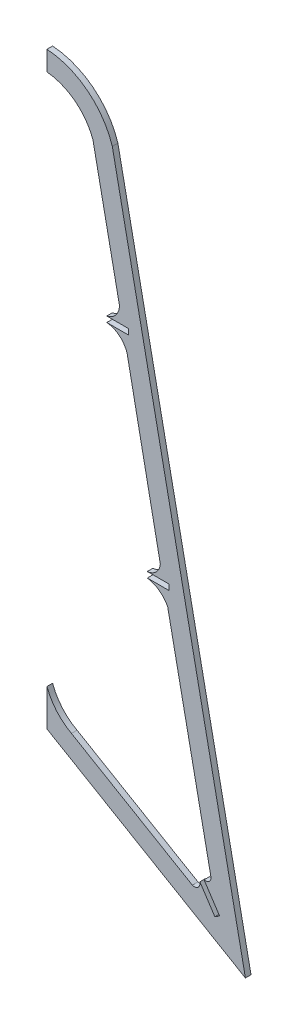
ISO-10303-21;
HEADER;
FILE_DESCRIPTION(('STEP AP214'),'2;1');
FILE_NAME('part.step','',(''),(''),'','','');
FILE_SCHEMA(('AUTOMOTIVE_DESIGN { 1 0 10303 214 1 1 1 1 }'));
ENDSEC;
DATA;
#1=APPLICATION_CONTEXT('core data for automotive mechanical design processes');
#2=APPLICATION_PROTOCOL_DEFINITION('international standard','automotive_design',2000,#1);
#3=PRODUCT_CONTEXT('',#1,'mechanical');
#4=PRODUCT('Part','Part','',(#3));
#5=PRODUCT_RELATED_PRODUCT_CATEGORY('part','',(#4));
#6=PRODUCT_DEFINITION_FORMATION('','',#4);
#7=PRODUCT_DEFINITION_CONTEXT('part definition',#1,'design');
#8=PRODUCT_DEFINITION('design','',#6,#7);
#9=PRODUCT_DEFINITION_SHAPE('','',#8);
#10=(LENGTH_UNIT() NAMED_UNIT(*) SI_UNIT(.MILLI.,.METRE.));
#11=(NAMED_UNIT(*) PLANE_ANGLE_UNIT() SI_UNIT($,.RADIAN.));
#12=(NAMED_UNIT(*) SI_UNIT($,.STERADIAN.) SOLID_ANGLE_UNIT());
#13=UNCERTAINTY_MEASURE_WITH_UNIT(LENGTH_MEASURE(1.E-05),#10,'distance_accuracy_value','');
#14=(GEOMETRIC_REPRESENTATION_CONTEXT(3) GLOBAL_UNCERTAINTY_ASSIGNED_CONTEXT((#13)) GLOBAL_UNIT_ASSIGNED_CONTEXT((#10,
#11,#12)) REPRESENTATION_CONTEXT('',''));
#15=CARTESIAN_POINT('',(0.,0.,0.));
#16=DIRECTION('',(0.,0.,1.));
#17=DIRECTION('',(1.,0.,0.));
#18=AXIS2_PLACEMENT_3D('',#15,#16,#17);
#19=CARTESIAN_POINT('',(-169.581359438299,267.529882646893,2.));
#20=DIRECTION('',(0.,0.,-1.));
#21=DIRECTION('',(-1.,0.,0.));
#22=AXIS2_PLACEMENT_3D('',#19,#20,#21);
#23=CYLINDRICAL_SURFACE('',#22,26.3449884460073);
#24=CARTESIAN_POINT('',(-169.581359438299,267.529882646893,0.));
#25=DIRECTION('',(0.,0.,1.));
#26=DIRECTION('',(1.,0.,0.));
#27=AXIS2_PLACEMENT_3D('',#24,#25,#26);
#28=CIRCLE('',#27,26.3449884460073);
#29=CARTESIAN_POINT('',(-144.463489000568,275.476643049322,0.));
#30=VERTEX_POINT('',#29);
#31=CARTESIAN_POINT('',(-167.743625943436,293.810696025138,0.));
#32=VERTEX_POINT('',#31);
#33=EDGE_CURVE('E237',#30,#32,#28,.T.);
#34=ORIENTED_EDGE('',*,*,#33,.T.);
#35=DIRECTION('',(0.,0.,-1.));
#36=VECTOR('',#35,1.);
#37=CARTESIAN_POINT('',(-167.743625943436,293.810696025138,2.));
#38=LINE('',#37,#36);
#39=CARTESIAN_POINT('',(-167.743625943436,293.810696025138,2.));
#40=VERTEX_POINT('',#39);
#41=EDGE_CURVE('E11',#40,#32,#38,.T.);
#42=ORIENTED_EDGE('',*,*,#41,.F.);
#43=CARTESIAN_POINT('',(-169.581359438299,267.529882646893,2.));
#44=DIRECTION('',(0.,0.,1.));
#45=DIRECTION('',(1.,0.,0.));
#46=AXIS2_PLACEMENT_3D('',#43,#44,#45);
#47=CIRCLE('',#46,26.3449884460073);
#48=CARTESIAN_POINT('',(-144.463489000568,275.476643049322,2.));
#49=VERTEX_POINT('',#48);
#50=EDGE_CURVE('E287',#49,#40,#47,.T.);
#51=ORIENTED_EDGE('',*,*,#50,.F.);
#52=DIRECTION('',(0.,0.,-1.));
#53=VECTOR('',#52,1.);
#54=CARTESIAN_POINT('',(-144.463489000568,275.476643049322,2.));
#55=LINE('',#54,#53);
#56=EDGE_CURVE('E233',#49,#30,#55,.T.);
#57=ORIENTED_EDGE('',*,*,#56,.T.);
#58=EDGE_LOOP('',(#34,#42,#51,#57));
#59=FACE_BOUND('',#58,.T.);
#60=ADVANCED_FACE('F33',(#59),#23,.T.);
#61=CARTESIAN_POINT('',(-167.743625943436,293.810696025138,2.));
#62=DIRECTION('',(0.999999950893562,-0.000313389331779472,0.));
#63=DIRECTION('',(0.000313389331779472,0.999999950893562,0.));
#64=AXIS2_PLACEMENT_3D('',#61,#62,#63);
#65=PLANE('',#64);
#66=DIRECTION('',(-0.000313389331779472,-0.999999950893562,0.));
#67=VECTOR('',#66,1.);
#68=CARTESIAN_POINT('',(-167.743625943436,293.810696025138,0.));
#69=LINE('',#68,#67);
#70=CARTESIAN_POINT('',(-167.74582690555,286.787604353295,0.));
#71=VERTEX_POINT('',#70);
#72=EDGE_CURVE('E240',#32,#71,#69,.T.);
#73=ORIENTED_EDGE('',*,*,#72,.T.);
#74=DIRECTION('',(0.,0.,-1.));
#75=VECTOR('',#74,1.);
#76=CARTESIAN_POINT('',(-167.74582690555,286.787604353295,2.));
#77=LINE('',#76,#75);
#78=CARTESIAN_POINT('',(-167.74582690555,286.787604353295,2.));
#79=VERTEX_POINT('',#78);
#80=EDGE_CURVE('E41',#79,#71,#77,.T.);
#81=ORIENTED_EDGE('',*,*,#80,.F.);
#82=DIRECTION('',(-0.000313389331779472,-0.999999950893562,0.));
#83=VECTOR('',#82,1.);
#84=CARTESIAN_POINT('',(-167.743625943436,293.810696025138,2.));
#85=LINE('',#84,#83);
#86=EDGE_CURVE('E146',#40,#79,#85,.T.);
#87=ORIENTED_EDGE('',*,*,#86,.F.);
#88=ORIENTED_EDGE('',*,*,#41,.T.);
#89=EDGE_LOOP('',(#73,#81,#87,#88));
#90=FACE_BOUND('',#89,.T.);
#91=ADVANCED_FACE('F435',(#90),#65,.F.);
#92=CARTESIAN_POINT('',(-169.581359438299,267.529882646893,2.));
#93=DIRECTION('',(0.,0.,-1.));
#94=DIRECTION('',(-1.,0.,0.));
#95=AXIS2_PLACEMENT_3D('',#92,#93,#94);
#96=CYLINDRICAL_SURFACE('',#95,19.3450000000001);
#97=CARTESIAN_POINT('',(-169.581359438299,267.529882646893,0.));
#98=DIRECTION('',(0.,0.,-1.));
#99=DIRECTION('',(1.,0.,0.));
#100=AXIS2_PLACEMENT_3D('',#97,#98,#99);
#101=CIRCLE('',#100,19.3450000000001);
#102=CARTESIAN_POINT('',(-151.354655658788,274.011880358553,0.));
#103=VERTEX_POINT('',#102);
#104=EDGE_CURVE('E242',#71,#103,#101,.T.);
#105=ORIENTED_EDGE('',*,*,#104,.T.);
#106=DIRECTION('',(0.,0.,-1.));
#107=VECTOR('',#106,1.);
#108=CARTESIAN_POINT('',(-151.354655658788,274.011880358553,2.));
#109=LINE('',#108,#107);
#110=CARTESIAN_POINT('',(-151.354655658788,274.011880358553,2.));
#111=VERTEX_POINT('',#110);
#112=EDGE_CURVE('E348',#111,#103,#109,.T.);
#113=ORIENTED_EDGE('',*,*,#112,.F.);
#114=CARTESIAN_POINT('',(-169.581359438299,267.529882646893,2.));
#115=DIRECTION('',(0.,0.,-1.));
#116=DIRECTION('',(1.,0.,0.));
#117=AXIS2_PLACEMENT_3D('',#114,#115,#116);
#118=CIRCLE('',#117,19.3450000000001);
#119=EDGE_CURVE('E356',#79,#111,#118,.T.);
#120=ORIENTED_EDGE('',*,*,#119,.F.);
#121=ORIENTED_EDGE('',*,*,#80,.T.);
#122=EDGE_LOOP('',(#105,#113,#120,#121));
#123=FACE_BOUND('',#122,.T.);
#124=ADVANCED_FACE('F354',(#123),#96,.F.);
#125=CARTESIAN_POINT('',(-151.354655658788,274.011880358553,2.));
#126=DIRECTION('',(0.979887703080504,0.199549716490936,0.));
#127=DIRECTION('',(-0.199549716490936,0.979887703080505,0.));
#128=AXIS2_PLACEMENT_3D('',#125,#126,#127);
#129=PLANE('',#128);
#130=DIRECTION('',(0.199549716490936,-0.979887703080504,0.));
#131=VECTOR('',#130,1.);
#132=CARTESIAN_POINT('',(-151.354655658788,274.011880358553,0.));
#133=LINE('',#132,#131);
#134=CARTESIAN_POINT('',(-141.897210514378,227.571151889828,0.));
#135=VERTEX_POINT('',#134);
#136=EDGE_CURVE('E244',#103,#135,#133,.T.);
#137=ORIENTED_EDGE('',*,*,#136,.T.);
#138=DIRECTION('',(0.,0.,-1.));
#139=VECTOR('',#138,1.);
#140=CARTESIAN_POINT('',(-141.897210514378,227.571151889828,2.));
#141=LINE('',#140,#139);
#142=CARTESIAN_POINT('',(-141.897210514378,227.571151889828,2.));
#143=VERTEX_POINT('',#142);
#144=EDGE_CURVE('E345',#143,#135,#141,.T.);
#145=ORIENTED_EDGE('',*,*,#144,.F.);
#146=DIRECTION('',(0.199549716490936,-0.979887703080504,0.));
#147=VECTOR('',#146,1.);
#148=CARTESIAN_POINT('',(-151.354655658788,274.011880358553,2.));
#149=LINE('',#148,#147);
#150=EDGE_CURVE('E374',#111,#143,#149,.T.);
#151=ORIENTED_EDGE('',*,*,#150,.F.);
#152=ORIENTED_EDGE('',*,*,#112,.T.);
#153=EDGE_LOOP('',(#137,#145,#151,#152));
#154=FACE_BOUND('',#153,.T.);
#155=ADVANCED_FACE('F365',(#154),#129,.F.);
#156=CARTESIAN_POINT('',(-147.604552213015,227.699552673555,2.));
#157=DIRECTION('',(0.,0.,-1.));
#158=DIRECTION('',(-1.,0.,0.));
#159=AXIS2_PLACEMENT_3D('',#156,#157,#158);
#160=CYLINDRICAL_SURFACE('',#159,5.70878586270888);
#161=CARTESIAN_POINT('',(-147.604552213015,227.699552673555,0.));
#162=DIRECTION('',(0.,0.,-1.));
#163=DIRECTION('',(1.,0.,0.));
#164=AXIS2_PLACEMENT_3D('',#161,#162,#163);
#165=CIRCLE('',#164,5.70878586270888);
#166=CARTESIAN_POINT('',(-146.432560896096,222.112364438017,0.));
#167=VERTEX_POINT('',#166);
#168=EDGE_CURVE('E246',#135,#167,#165,.T.);
#169=ORIENTED_EDGE('',*,*,#168,.T.);
#170=DIRECTION('',(0.,0.,-1.));
#171=VECTOR('',#170,1.);
#172=CARTESIAN_POINT('',(-146.432560896096,222.112364438017,2.));
#173=LINE('',#172,#171);
#174=CARTESIAN_POINT('',(-146.432560896096,222.112364438017,2.));
#175=VERTEX_POINT('',#174);
#176=EDGE_CURVE('E342',#175,#167,#173,.T.);
#177=ORIENTED_EDGE('',*,*,#176,.F.);
#178=CARTESIAN_POINT('',(-147.604552213015,227.699552673555,2.));
#179=DIRECTION('',(0.,0.,-1.));
#180=DIRECTION('',(1.,0.,0.));
#181=AXIS2_PLACEMENT_3D('',#178,#179,#180);
#182=CIRCLE('',#181,5.70878586270888);
#183=EDGE_CURVE('E371',#143,#175,#182,.T.);
#184=ORIENTED_EDGE('',*,*,#183,.F.);
#185=ORIENTED_EDGE('',*,*,#144,.T.);
#186=EDGE_LOOP('',(#169,#177,#184,#185));
#187=FACE_BOUND('',#186,.T.);
#188=ADVANCED_FACE('F369',(#187),#160,.F.);
#189=CARTESIAN_POINT('',(-146.432560896096,222.112364438017,2.));
#190=DIRECTION('',(0.,1.,0.));
#191=DIRECTION('',(0.,0.,1.));
#192=AXIS2_PLACEMENT_3D('',#189,#190,#191);
#193=PLANE('',#192);
#194=DIRECTION('',(1.,0.,0.));
#195=VECTOR('',#194,1.);
#196=CARTESIAN_POINT('',(-146.432560896096,222.112364438017,0.));
#197=LINE('',#196,#195);
#198=CARTESIAN_POINT('',(-138.679952297794,222.112364438017,0.));
#199=VERTEX_POINT('',#198);
#200=EDGE_CURVE('E248',#167,#199,#197,.T.);
#201=ORIENTED_EDGE('',*,*,#200,.T.);
#202=DIRECTION('',(0.,0.,-1.));
#203=VECTOR('',#202,1.);
#204=CARTESIAN_POINT('',(-138.679952297794,222.112364438017,2.));
#205=LINE('',#204,#203);
#206=CARTESIAN_POINT('',(-138.679952297794,222.112364438017,2.));
#207=VERTEX_POINT('',#206);
#208=EDGE_CURVE('E339',#207,#199,#205,.T.);
#209=ORIENTED_EDGE('',*,*,#208,.F.);
#210=DIRECTION('',(1.,0.,0.));
#211=VECTOR('',#210,1.);
#212=CARTESIAN_POINT('',(-146.432560896096,222.112364438017,2.));
#213=LINE('',#212,#211);
#214=EDGE_CURVE('E373',#175,#207,#213,.T.);
#215=ORIENTED_EDGE('',*,*,#214,.F.);
#216=ORIENTED_EDGE('',*,*,#176,.T.);
#217=EDGE_LOOP('',(#201,#209,#215,#216));
#218=FACE_BOUND('',#217,.T.);
#219=ADVANCED_FACE('F448',(#218),#193,.F.);
#220=CARTESIAN_POINT('',(-138.679952297794,222.112364438017,2.));
#221=DIRECTION('',(1.,0.,0.));
#222=DIRECTION('',(0.,0.,-1.));
#223=AXIS2_PLACEMENT_3D('',#220,#221,#222);
#224=PLANE('',#223);
#225=DIRECTION('',(0.,-1.,0.));
#226=VECTOR('',#225,1.);
#227=CARTESIAN_POINT('',(-138.679952297794,222.112364438017,0.));
#228=LINE('',#227,#226);
#229=CARTESIAN_POINT('',(-138.679952297794,220.112364438017,0.));
#230=VERTEX_POINT('',#229);
#231=EDGE_CURVE('E250',#199,#230,#228,.T.);
#232=ORIENTED_EDGE('',*,*,#231,.T.);
#233=DIRECTION('',(0.,0.,-1.));
#234=VECTOR('',#233,1.);
#235=CARTESIAN_POINT('',(-138.679952297794,220.112364438017,2.));
#236=LINE('',#235,#234);
#237=CARTESIAN_POINT('',(-138.679952297794,220.112364438017,2.));
#238=VERTEX_POINT('',#237);
#239=EDGE_CURVE('E336',#238,#230,#236,.T.);
#240=ORIENTED_EDGE('',*,*,#239,.F.);
#241=DIRECTION('',(0.,-1.,0.));
#242=VECTOR('',#241,1.);
#243=CARTESIAN_POINT('',(-138.679952297794,222.112364438017,2.));
#244=LINE('',#243,#242);
#245=EDGE_CURVE('E376',#207,#238,#244,.T.);
#246=ORIENTED_EDGE('',*,*,#245,.F.);
#247=ORIENTED_EDGE('',*,*,#208,.T.);
#248=EDGE_LOOP('',(#232,#240,#246,#247));
#249=FACE_BOUND('',#248,.T.);
#250=ADVANCED_FACE('F451',(#249),#224,.F.);
#251=CARTESIAN_POINT('',(-138.679952297794,220.112364438017,2.));
#252=DIRECTION('',(-1.43206381509877E-13,-1.,0.));
#253=DIRECTION('',(1.,-1.43206381509877E-13,0.));
#254=AXIS2_PLACEMENT_3D('',#251,#252,#253);
#255=PLANE('',#254);
#256=DIRECTION('',(-1.,1.43206381509877E-13,0.));
#257=VECTOR('',#256,1.);
#258=CARTESIAN_POINT('',(-138.679952297794,220.112364438017,0.));
#259=LINE('',#258,#257);
#260=CARTESIAN_POINT('',(-146.432560896096,220.112364438018,0.));
#261=VERTEX_POINT('',#260);
#262=EDGE_CURVE('E252',#230,#261,#259,.T.);
#263=ORIENTED_EDGE('',*,*,#262,.T.);
#264=DIRECTION('',(0.,0.,-1.));
#265=VECTOR('',#264,1.);
#266=CARTESIAN_POINT('',(-146.432560896096,220.112364438018,2.));
#267=LINE('',#266,#265);
#268=CARTESIAN_POINT('',(-146.432560896096,220.112364438018,2.));
#269=VERTEX_POINT('',#268);
#270=EDGE_CURVE('E333',#269,#261,#267,.T.);
#271=ORIENTED_EDGE('',*,*,#270,.F.);
#272=DIRECTION('',(-1.,1.43206381509877E-13,0.));
#273=VECTOR('',#272,1.);
#274=CARTESIAN_POINT('',(-138.679952297794,220.112364438017,2.));
#275=LINE('',#274,#273);
#276=EDGE_CURVE('E382',#238,#269,#275,.T.);
#277=ORIENTED_EDGE('',*,*,#276,.F.);
#278=ORIENTED_EDGE('',*,*,#239,.T.);
#279=EDGE_LOOP('',(#263,#271,#277,#278));
#280=FACE_BOUND('',#279,.T.);
#281=ADVANCED_FACE('F455',(#280),#255,.F.);
#282=CARTESIAN_POINT('',(-147.208362580016,211.751156181154,2.));
#283=DIRECTION('',(0.,0.,-1.));
#284=DIRECTION('',(-1.,0.,0.));
#285=AXIS2_PLACEMENT_3D('',#282,#283,#284);
#286=CYLINDRICAL_SURFACE('',#285,8.39712282674394);
#287=CARTESIAN_POINT('',(-147.208362580016,211.751156181154,0.));
#288=DIRECTION('',(0.,0.,-1.));
#289=DIRECTION('',(1.,0.,0.));
#290=AXIS2_PLACEMENT_3D('',#287,#288,#289);
#291=CIRCLE('',#290,8.39712282674394);
#292=CARTESIAN_POINT('',(-139.1701284323,214.179831448438,0.));
#293=VERTEX_POINT('',#292);
#294=EDGE_CURVE('E254',#261,#293,#291,.T.);
#295=ORIENTED_EDGE('',*,*,#294,.T.);
#296=DIRECTION('',(0.,0.,-1.));
#297=VECTOR('',#296,1.);
#298=CARTESIAN_POINT('',(-139.1701284323,214.179831448438,2.));
#299=LINE('',#298,#297);
#300=CARTESIAN_POINT('',(-139.1701284323,214.179831448438,2.));
#301=VERTEX_POINT('',#300);
#302=EDGE_CURVE('E330',#301,#293,#299,.T.);
#303=ORIENTED_EDGE('',*,*,#302,.F.);
#304=CARTESIAN_POINT('',(-147.208362580016,211.751156181154,2.));
#305=DIRECTION('',(0.,0.,-1.));
#306=DIRECTION('',(1.,0.,0.));
#307=AXIS2_PLACEMENT_3D('',#304,#305,#306);
#308=CIRCLE('',#307,8.39712282674394);
#309=EDGE_CURVE('E384',#269,#301,#308,.T.);
#310=ORIENTED_EDGE('',*,*,#309,.F.);
#311=ORIENTED_EDGE('',*,*,#270,.T.);
#312=EDGE_LOOP('',(#295,#303,#310,#311));
#313=FACE_BOUND('',#312,.T.);
#314=ADVANCED_FACE('F459',(#313),#286,.F.);
#315=CARTESIAN_POINT('',(-139.1701284323,214.179831448438,2.));
#316=DIRECTION('',(0.980552630104531,0.196256310968813,0.));
#317=DIRECTION('',(-0.196256310968813,0.980552630104531,0.));
#318=AXIS2_PLACEMENT_3D('',#315,#316,#317);
#319=PLANE('',#318);
#320=DIRECTION('',(0.196256310968813,-0.980552630104531,0.));
#321=VECTOR('',#320,1.);
#322=CARTESIAN_POINT('',(-139.1701284323,214.179831448438,0.));
#323=LINE('',#322,#321);
#324=CARTESIAN_POINT('',(-127.347591585276,155.111057850124,0.));
#325=VERTEX_POINT('',#324);
#326=EDGE_CURVE('E256',#293,#325,#323,.T.);
#327=ORIENTED_EDGE('',*,*,#326,.T.);
#328=DIRECTION('',(0.,0.,-1.));
#329=VECTOR('',#328,1.);
#330=CARTESIAN_POINT('',(-127.347591585276,155.111057850124,2.));
#331=LINE('',#330,#329);
#332=CARTESIAN_POINT('',(-127.347591585276,155.111057850124,2.));
#333=VERTEX_POINT('',#332);
#334=EDGE_CURVE('E327',#333,#325,#331,.T.);
#335=ORIENTED_EDGE('',*,*,#334,.F.);
#336=DIRECTION('',(0.196256310968813,-0.980552630104531,0.));
#337=VECTOR('',#336,1.);
#338=CARTESIAN_POINT('',(-139.1701284323,214.179831448438,2.));
#339=LINE('',#338,#337);
#340=EDGE_CURVE('E386',#301,#333,#339,.T.);
#341=ORIENTED_EDGE('',*,*,#340,.F.);
#342=ORIENTED_EDGE('',*,*,#302,.T.);
#343=EDGE_LOOP('',(#327,#335,#341,#342));
#344=FACE_BOUND('',#343,.T.);
#345=ADVANCED_FACE('F463',(#344),#319,.F.);
#346=CARTESIAN_POINT('',(-132.404934353409,155.523813116344,2.));
#347=DIRECTION('',(0.,0.,-1.));
#348=DIRECTION('',(-1.,0.,0.));
#349=AXIS2_PLACEMENT_3D('',#346,#347,#348);
#350=CYLINDRICAL_SURFACE('',#349,5.07415833258849);
#351=CARTESIAN_POINT('',(-132.404934353409,155.523813116344,0.));
#352=DIRECTION('',(0.,0.,-1.));
#353=DIRECTION('',(1.,0.,0.));
#354=AXIS2_PLACEMENT_3D('',#351,#352,#353);
#355=CIRCLE('',#354,5.07415833258849);
#356=CARTESIAN_POINT('',(-131.991729698829,150.466507045162,0.));
#357=VERTEX_POINT('',#356);
#358=EDGE_CURVE('E258',#325,#357,#355,.T.);
#359=ORIENTED_EDGE('',*,*,#358,.T.);
#360=DIRECTION('',(0.,0.,-1.));
#361=VECTOR('',#360,1.);
#362=CARTESIAN_POINT('',(-131.991729698829,150.466507045162,2.));
#363=LINE('',#362,#361);
#364=CARTESIAN_POINT('',(-131.991729698829,150.466507045162,2.));
#365=VERTEX_POINT('',#364);
#366=EDGE_CURVE('E324',#365,#357,#363,.T.);
#367=ORIENTED_EDGE('',*,*,#366,.F.);
#368=CARTESIAN_POINT('',(-132.404934353409,155.523813116344,2.));
#369=DIRECTION('',(0.,0.,-1.));
#370=DIRECTION('',(1.,0.,0.));
#371=AXIS2_PLACEMENT_3D('',#368,#369,#370);
#372=CIRCLE('',#371,5.07415833258849);
#373=EDGE_CURVE('E388',#333,#365,#372,.T.);
#374=ORIENTED_EDGE('',*,*,#373,.F.);
#375=ORIENTED_EDGE('',*,*,#334,.T.);
#376=EDGE_LOOP('',(#359,#367,#374,#375));
#377=FACE_BOUND('',#376,.T.);
#378=ADVANCED_FACE('F467',(#377),#350,.F.);
#379=CARTESIAN_POINT('',(-124.202532500798,150.46556118674,2.));
#380=DIRECTION('',(0.000121432079720749,0.999999992627125,0.));
#381=DIRECTION('',(-0.999999992627125,0.000121432079720749,0.));
#382=AXIS2_PLACEMENT_3D('',#379,#380,#381);
#383=PLANE('',#382);
#384=DIRECTION('',(0.999999992627125,-0.000121432079720749,0.));
#385=VECTOR('',#384,1.);
#386=CARTESIAN_POINT('',(-124.202532500798,150.46556118674,0.));
#387=LINE('',#386,#385);
#388=CARTESIAN_POINT('',(-124.202532500798,150.46556118674,0.));
#389=VERTEX_POINT('',#388);
#390=EDGE_CURVE('E260',#357,#389,#387,.T.);
#391=ORIENTED_EDGE('',*,*,#390,.T.);
#392=DIRECTION('',(0.,0.,-1.));
#393=VECTOR('',#392,1.);
#394=CARTESIAN_POINT('',(-124.202532500798,150.46556118674,2.));
#395=LINE('',#394,#393);
#396=CARTESIAN_POINT('',(-124.202532500798,150.46556118674,2.));
#397=VERTEX_POINT('',#396);
#398=EDGE_CURVE('E321',#397,#389,#395,.T.);
#399=ORIENTED_EDGE('',*,*,#398,.F.);
#400=DIRECTION('',(0.999999992627125,-0.000121432079720749,0.));
#401=VECTOR('',#400,1.);
#402=CARTESIAN_POINT('',(-124.202532500798,150.46556118674,2.));
#403=LINE('',#402,#401);
#404=EDGE_CURVE('E390',#365,#397,#403,.T.);
#405=ORIENTED_EDGE('',*,*,#404,.F.);
#406=ORIENTED_EDGE('',*,*,#366,.T.);
#407=EDGE_LOOP('',(#391,#399,#405,#406));
#408=FACE_BOUND('',#407,.T.);
#409=ADVANCED_FACE('F471',(#408),#383,.F.);
#410=CARTESIAN_POINT('',(-124.202532500798,148.46556118674,2.));
#411=DIRECTION('',(1.,0.,0.));
#412=DIRECTION('',(0.,0.,-1.));
#413=AXIS2_PLACEMENT_3D('',#410,#411,#412);
#414=PLANE('',#413);
#415=DIRECTION('',(0.,-1.,0.));
#416=VECTOR('',#415,1.);
#417=CARTESIAN_POINT('',(-124.202532500798,148.46556118674,0.));
#418=LINE('',#417,#416);
#419=CARTESIAN_POINT('',(-124.202532500798,148.46556118674,0.));
#420=VERTEX_POINT('',#419);
#421=EDGE_CURVE('E262',#389,#420,#418,.T.);
#422=ORIENTED_EDGE('',*,*,#421,.T.);
#423=DIRECTION('',(0.,0.,-1.));
#424=VECTOR('',#423,1.);
#425=CARTESIAN_POINT('',(-124.202532500798,148.46556118674,2.));
#426=LINE('',#425,#424);
#427=CARTESIAN_POINT('',(-124.202532500798,148.46556118674,2.));
#428=VERTEX_POINT('',#427);
#429=EDGE_CURVE('E318',#428,#420,#426,.T.);
#430=ORIENTED_EDGE('',*,*,#429,.F.);
#431=DIRECTION('',(0.,-1.,0.));
#432=VECTOR('',#431,1.);
#433=CARTESIAN_POINT('',(-124.202532500798,148.46556118674,2.));
#434=LINE('',#433,#432);
#435=EDGE_CURVE('E392',#397,#428,#434,.T.);
#436=ORIENTED_EDGE('',*,*,#435,.F.);
#437=ORIENTED_EDGE('',*,*,#398,.T.);
#438=EDGE_LOOP('',(#422,#430,#436,#437));
#439=FACE_BOUND('',#438,.T.);
#440=ADVANCED_FACE('F475',(#439),#414,.F.);
#441=CARTESIAN_POINT('',(-131.975142876382,148.46556118674,2.));
#442=DIRECTION('',(0.,-1.,0.));
#443=DIRECTION('',(0.,0.,-1.));
#444=AXIS2_PLACEMENT_3D('',#441,#442,#443);
#445=PLANE('',#444);
#446=DIRECTION('',(-1.,0.,0.));
#447=VECTOR('',#446,1.);
#448=CARTESIAN_POINT('',(-131.975142876382,148.46556118674,0.));
#449=LINE('',#448,#447);
#450=CARTESIAN_POINT('',(-131.975142876382,148.46556118674,0.));
#451=VERTEX_POINT('',#450);
#452=EDGE_CURVE('E264',#420,#451,#449,.T.);
#453=ORIENTED_EDGE('',*,*,#452,.T.);
#454=DIRECTION('',(0.,0.,-1.));
#455=VECTOR('',#454,1.);
#456=CARTESIAN_POINT('',(-131.975142876382,148.46556118674,2.));
#457=LINE('',#456,#455);
#458=CARTESIAN_POINT('',(-131.975142876382,148.46556118674,2.));
#459=VERTEX_POINT('',#458);
#460=EDGE_CURVE('E315',#459,#451,#457,.T.);
#461=ORIENTED_EDGE('',*,*,#460,.F.);
#462=DIRECTION('',(-1.,0.,0.));
#463=VECTOR('',#462,1.);
#464=CARTESIAN_POINT('',(-131.975142876382,148.46556118674,2.));
#465=LINE('',#464,#463);
#466=EDGE_CURVE('E394',#428,#459,#465,.T.);
#467=ORIENTED_EDGE('',*,*,#466,.F.);
#468=ORIENTED_EDGE('',*,*,#429,.T.);
#469=EDGE_LOOP('',(#453,#461,#467,#468));
#470=FACE_BOUND('',#469,.T.);
#471=ADVANCED_FACE('F479',(#470),#445,.F.);
#472=CARTESIAN_POINT('',(-133.445473819778,138.794497559774,2.));
#473=DIRECTION('',(0.,0.,-1.));
#474=DIRECTION('',(-1.,0.,0.));
#475=AXIS2_PLACEMENT_3D('',#472,#473,#474);
#476=CYLINDRICAL_SURFACE('',#475,9.78219529348757);
#477=CARTESIAN_POINT('',(-133.445473819778,138.794497559774,0.));
#478=DIRECTION('',(0.,0.,-1.));
#479=DIRECTION('',(1.,0.,0.));
#480=AXIS2_PLACEMENT_3D('',#477,#478,#479);
#481=CIRCLE('',#480,9.78219529348757);
#482=CARTESIAN_POINT('',(-124.718064663381,143.213057752504,0.));
#483=VERTEX_POINT('',#482);
#484=EDGE_CURVE('E266',#451,#483,#481,.T.);
#485=ORIENTED_EDGE('',*,*,#484,.T.);
#486=DIRECTION('',(0.,0.,-1.));
#487=VECTOR('',#486,1.);
#488=CARTESIAN_POINT('',(-124.718064663381,143.213057752504,2.));
#489=LINE('',#488,#487);
#490=CARTESIAN_POINT('',(-124.718064663381,143.213057752504,2.));
#491=VERTEX_POINT('',#490);
#492=EDGE_CURVE('E312',#491,#483,#489,.T.);
#493=ORIENTED_EDGE('',*,*,#492,.F.);
#494=CARTESIAN_POINT('',(-133.445473819778,138.794497559774,2.));
#495=DIRECTION('',(0.,0.,-1.));
#496=DIRECTION('',(1.,0.,0.));
#497=AXIS2_PLACEMENT_3D('',#494,#495,#496);
#498=CIRCLE('',#497,9.78219529348757);
#499=EDGE_CURVE('E396',#459,#491,#498,.T.);
#500=ORIENTED_EDGE('',*,*,#499,.F.);
#501=ORIENTED_EDGE('',*,*,#460,.T.);
#502=EDGE_LOOP('',(#485,#493,#500,#501));
#503=FACE_BOUND('',#502,.T.);
#504=ADVANCED_FACE('F483',(#503),#476,.F.);
#505=CARTESIAN_POINT('',(-124.718064663381,143.213057752504,2.));
#506=DIRECTION('',(0.979887703080503,0.199549716490943,0.));
#507=DIRECTION('',(-0.199549716490943,0.979887703080503,0.));
#508=AXIS2_PLACEMENT_3D('',#505,#506,#507);
#509=PLANE('',#508);
#510=DIRECTION('',(0.199549716490943,-0.979887703080503,0.));
#511=VECTOR('',#510,1.);
#512=CARTESIAN_POINT('',(-124.718064663381,143.213057752504,0.));
#513=LINE('',#512,#511);
#514=CARTESIAN_POINT('',(-109.314139037206,67.5721720339745,0.));
#515=VERTEX_POINT('',#514);
#516=EDGE_CURVE('E268',#483,#515,#513,.T.);
#517=ORIENTED_EDGE('',*,*,#516,.T.);
#518=DIRECTION('',(0.,0.,-1.));
#519=VECTOR('',#518,1.);
#520=CARTESIAN_POINT('',(-109.314139037206,67.5721720339745,2.));
#521=LINE('',#520,#519);
#522=CARTESIAN_POINT('',(-109.314139037206,67.5721720339745,2.));
#523=VERTEX_POINT('',#522);
#524=EDGE_CURVE('E309',#523,#515,#521,.T.);
#525=ORIENTED_EDGE('',*,*,#524,.F.);
#526=DIRECTION('',(0.199549716490943,-0.979887703080503,0.));
#527=VECTOR('',#526,1.);
#528=CARTESIAN_POINT('',(-124.718064663381,143.213057752504,2.));
#529=LINE('',#528,#527);
#530=EDGE_CURVE('E398',#491,#523,#529,.T.);
#531=ORIENTED_EDGE('',*,*,#530,.F.);
#532=ORIENTED_EDGE('',*,*,#492,.T.);
#533=EDGE_LOOP('',(#517,#525,#531,#532));
#534=FACE_BOUND('',#533,.T.);
#535=ADVANCED_FACE('F487',(#534),#509,.F.);
#536=CARTESIAN_POINT('',(-111.249549060774,67.2897595549481,2.));
#537=DIRECTION('',(0.,0.,-1.));
#538=DIRECTION('',(-1.,0.,0.));
#539=AXIS2_PLACEMENT_3D('',#536,#537,#538);
#540=CYLINDRICAL_SURFACE('',#539,1.95590612444396);
#541=CARTESIAN_POINT('',(-111.249549060774,67.2897595549481,0.));
#542=DIRECTION('',(0.,0.,-1.));
#543=DIRECTION('',(1.,0.,0.));
#544=AXIS2_PLACEMENT_3D('',#541,#542,#543);
#545=CIRCLE('',#544,1.95590612444396);
#546=CARTESIAN_POINT('',(-111.744040833778,65.3973941953865,0.));
#547=VERTEX_POINT('',#546);
#548=EDGE_CURVE('E270',#515,#547,#545,.T.);
#549=ORIENTED_EDGE('',*,*,#548,.T.);
#550=DIRECTION('',(0.,0.,-1.));
#551=VECTOR('',#550,1.);
#552=CARTESIAN_POINT('',(-111.744040833778,65.3973941953865,2.));
#553=LINE('',#552,#551);
#554=CARTESIAN_POINT('',(-111.744040833778,65.3973941953865,2.));
#555=VERTEX_POINT('',#554);
#556=EDGE_CURVE('E306',#555,#547,#553,.T.);
#557=ORIENTED_EDGE('',*,*,#556,.F.);
#558=CARTESIAN_POINT('',(-111.249549060774,67.2897595549481,2.));
#559=DIRECTION('',(0.,0.,-1.));
#560=DIRECTION('',(1.,0.,0.));
#561=AXIS2_PLACEMENT_3D('',#558,#559,#560);
#562=CIRCLE('',#561,1.95590612444396);
#563=EDGE_CURVE('E400',#523,#555,#562,.T.);
#564=ORIENTED_EDGE('',*,*,#563,.F.);
#565=ORIENTED_EDGE('',*,*,#524,.T.);
#566=EDGE_LOOP('',(#549,#557,#564,#565));
#567=FACE_BOUND('',#566,.T.);
#568=ADVANCED_FACE('F491',(#567),#540,.F.);
#569=CARTESIAN_POINT('',(-106.221436179066,57.0262391521466,2.));
#570=DIRECTION('',(0.834717471240344,0.550678439024197,0.));
#571=DIRECTION('',(-0.550678439024197,0.834717471240344,0.));
#572=AXIS2_PLACEMENT_3D('',#569,#570,#571);
#573=PLANE('',#572);
#574=DIRECTION('',(0.550678439024197,-0.834717471240344,0.));
#575=VECTOR('',#574,1.);
#576=CARTESIAN_POINT('',(-106.221436179066,57.0262391521466,0.));
#577=LINE('',#576,#575);
#578=CARTESIAN_POINT('',(-106.221436179066,57.0262391521466,0.));
#579=VERTEX_POINT('',#578);
#580=EDGE_CURVE('E272',#547,#579,#577,.T.);
#581=ORIENTED_EDGE('',*,*,#580,.T.);
#582=DIRECTION('',(0.,0.,-1.));
#583=VECTOR('',#582,1.);
#584=CARTESIAN_POINT('',(-106.221436179066,57.0262391521466,2.));
#585=LINE('',#584,#583);
#586=CARTESIAN_POINT('',(-106.221436179066,57.0262391521466,2.));
#587=VERTEX_POINT('',#586);
#588=EDGE_CURVE('E303',#587,#579,#585,.T.);
#589=ORIENTED_EDGE('',*,*,#588,.F.);
#590=DIRECTION('',(0.550678439024197,-0.834717471240344,0.));
#591=VECTOR('',#590,1.);
#592=CARTESIAN_POINT('',(-106.221436179066,57.0262391521466,2.));
#593=LINE('',#592,#591);
#594=EDGE_CURVE('E402',#555,#587,#593,.T.);
#595=ORIENTED_EDGE('',*,*,#594,.F.);
#596=ORIENTED_EDGE('',*,*,#556,.T.);
#597=EDGE_LOOP('',(#581,#589,#595,#596));
#598=FACE_BOUND('',#597,.T.);
#599=ADVANCED_FACE('F495',(#598),#573,.F.);
#600=CARTESIAN_POINT('',(-107.888289043611,55.920988196606,2.));
#601=DIRECTION('',(0.552626987358298,-0.833428708914741,0.));
#602=DIRECTION('',(0.833428708914741,0.552626987358298,0.));
#603=AXIS2_PLACEMENT_3D('',#600,#601,#602);
#604=PLANE('',#603);
#605=DIRECTION('',(-0.833428708914741,-0.552626987358298,0.));
#606=VECTOR('',#605,1.);
#607=CARTESIAN_POINT('',(-107.888289043611,55.920988196606,0.));
#608=LINE('',#607,#606);
#609=CARTESIAN_POINT('',(-107.888289043611,55.920988196606,0.));
#610=VERTEX_POINT('',#609);
#611=EDGE_CURVE('E274',#579,#610,#608,.T.);
#612=ORIENTED_EDGE('',*,*,#611,.T.);
#613=DIRECTION('',(0.,0.,-1.));
#614=VECTOR('',#613,1.);
#615=CARTESIAN_POINT('',(-107.888289043611,55.920988196606,2.));
#616=LINE('',#615,#614);
#617=CARTESIAN_POINT('',(-107.888289043611,55.920988196606,2.));
#618=VERTEX_POINT('',#617);
#619=EDGE_CURVE('E300',#618,#610,#616,.T.);
#620=ORIENTED_EDGE('',*,*,#619,.F.);
#621=DIRECTION('',(-0.833428708914741,-0.552626987358298,0.));
#622=VECTOR('',#621,1.);
#623=CARTESIAN_POINT('',(-107.888289043611,55.920988196606,2.));
#624=LINE('',#623,#622);
#625=EDGE_CURVE('E404',#587,#618,#624,.T.);
#626=ORIENTED_EDGE('',*,*,#625,.F.);
#627=ORIENTED_EDGE('',*,*,#588,.T.);
#628=EDGE_LOOP('',(#612,#620,#626,#627));
#629=FACE_BOUND('',#628,.T.);
#630=ADVANCED_FACE('F499',(#629),#604,.F.);
#631=CARTESIAN_POINT('',(-113.250526418095,64.0490798447626,2.));
#632=DIRECTION('',(-0.834718127224239,-0.5506774446836,0.));
#633=DIRECTION('',(0.5506774446836,-0.834718127224239,0.));
#634=AXIS2_PLACEMENT_3D('',#631,#632,#633);
#635=PLANE('',#634);
#636=DIRECTION('',(-0.5506774446836,0.834718127224239,0.));
#637=VECTOR('',#636,1.);
#638=CARTESIAN_POINT('',(-113.250526418095,64.0490798447626,0.));
#639=LINE('',#638,#637);
#640=CARTESIAN_POINT('',(-113.250526418095,64.0490798447626,0.));
#641=VERTEX_POINT('',#640);
#642=EDGE_CURVE('E276',#610,#641,#639,.T.);
#643=ORIENTED_EDGE('',*,*,#642,.T.);
#644=DIRECTION('',(0.,0.,-1.));
#645=VECTOR('',#644,1.);
#646=CARTESIAN_POINT('',(-113.250526418095,64.0490798447626,2.));
#647=LINE('',#646,#645);
#648=CARTESIAN_POINT('',(-113.250526418095,64.0490798447626,2.));
#649=VERTEX_POINT('',#648);
#650=EDGE_CURVE('E297',#649,#641,#647,.T.);
#651=ORIENTED_EDGE('',*,*,#650,.F.);
#652=DIRECTION('',(-0.5506774446836,0.834718127224239,0.));
#653=VECTOR('',#652,1.);
#654=CARTESIAN_POINT('',(-113.250526418095,64.0490798447626,2.));
#655=LINE('',#654,#653);
#656=EDGE_CURVE('E406',#618,#649,#655,.T.);
#657=ORIENTED_EDGE('',*,*,#656,.F.);
#658=ORIENTED_EDGE('',*,*,#619,.T.);
#659=EDGE_LOOP('',(#643,#651,#657,#658));
#660=FACE_BOUND('',#659,.T.);
#661=ADVANCED_FACE('F503',(#660),#635,.F.);
#662=CARTESIAN_POINT('',(-115.222388538361,63.575392197159,2.));
#663=DIRECTION('',(0.,0.,-1.));
#664=DIRECTION('',(-1.,0.,0.));
#665=AXIS2_PLACEMENT_3D('',#662,#663,#664);
#666=CYLINDRICAL_SURFACE('',#665,2.02795961715969);
#667=CARTESIAN_POINT('',(-115.222388538361,63.575392197159,0.));
#668=DIRECTION('',(0.,0.,-1.));
#669=DIRECTION('',(1.,0.,0.));
#670=AXIS2_PLACEMENT_3D('',#667,#668,#669);
#671=CIRCLE('',#670,2.02795961715969);
#672=CARTESIAN_POINT('',(-115.91101166002,61.6679283298349,0.));
#673=VERTEX_POINT('',#672);
#674=EDGE_CURVE('E278',#641,#673,#671,.T.);
#675=ORIENTED_EDGE('',*,*,#674,.T.);
#676=DIRECTION('',(0.,0.,-1.));
#677=VECTOR('',#676,1.);
#678=CARTESIAN_POINT('',(-115.91101166002,61.6679283298349,2.));
#679=LINE('',#678,#677);
#680=CARTESIAN_POINT('',(-115.91101166002,61.6679283298349,2.));
#681=VERTEX_POINT('',#680);
#682=EDGE_CURVE('E294',#681,#673,#679,.T.);
#683=ORIENTED_EDGE('',*,*,#682,.F.);
#684=CARTESIAN_POINT('',(-115.222388538361,63.575392197159,2.));
#685=DIRECTION('',(0.,0.,-1.));
#686=DIRECTION('',(1.,0.,0.));
#687=AXIS2_PLACEMENT_3D('',#684,#685,#686);
#688=CIRCLE('',#687,2.02795961715969);
#689=EDGE_CURVE('E408',#649,#681,#688,.T.);
#690=ORIENTED_EDGE('',*,*,#689,.F.);
#691=ORIENTED_EDGE('',*,*,#650,.T.);
#692=EDGE_LOOP('',(#675,#683,#690,#691));
#693=FACE_BOUND('',#692,.T.);
#694=ADVANCED_FACE('F507',(#693),#666,.F.);
#695=CARTESIAN_POINT('',(-159.023635769012,86.9601686673011,2.));
#696=DIRECTION('',(-0.50600718228676,-0.862529264126275,0.));
#697=DIRECTION('',(0.862529264126275,-0.50600718228676,0.));
#698=AXIS2_PLACEMENT_3D('',#695,#696,#697);
#699=PLANE('',#698);
#700=DIRECTION('',(-0.862529264126275,0.50600718228676,0.));
#701=VECTOR('',#700,1.);
#702=CARTESIAN_POINT('',(-159.023635769012,86.9601686673011,0.));
#703=LINE('',#702,#701);
#704=CARTESIAN_POINT('',(-159.023635769012,86.9601686673011,0.));
#705=VERTEX_POINT('',#704);
#706=EDGE_CURVE('E280',#673,#705,#703,.T.);
#707=ORIENTED_EDGE('',*,*,#706,.T.);
#708=DIRECTION('',(0.,0.,-1.));
#709=VECTOR('',#708,1.);
#710=CARTESIAN_POINT('',(-159.023635769012,86.9601686673011,2.));
#711=LINE('',#710,#709);
#712=CARTESIAN_POINT('',(-159.023635769012,86.9601686673011,2.));
#713=VERTEX_POINT('',#712);
#714=EDGE_CURVE('E291',#713,#705,#711,.T.);
#715=ORIENTED_EDGE('',*,*,#714,.F.);
#716=DIRECTION('',(-0.862529264126275,0.50600718228676,0.));
#717=VECTOR('',#716,1.);
#718=CARTESIAN_POINT('',(-159.023635769012,86.9601686673011,2.));
#719=LINE('',#718,#717);
#720=EDGE_CURVE('E410',#681,#713,#719,.T.);
#721=ORIENTED_EDGE('',*,*,#720,.F.);
#722=ORIENTED_EDGE('',*,*,#682,.T.);
#723=EDGE_LOOP('',(#707,#715,#721,#722));
#724=FACE_BOUND('',#723,.T.);
#725=ADVANCED_FACE('F416',(#724),#699,.F.);
#726=CARTESIAN_POINT('',(-150.11682295489,103.434791168473,2.));
#727=DIRECTION('',(0.,0.,-1.));
#728=DIRECTION('',(-1.,0.,0.));
#729=AXIS2_PLACEMENT_3D('',#726,#727,#728);
#730=CYLINDRICAL_SURFACE('',#729,18.7281739916609);
#731=CARTESIAN_POINT('',(-150.11682295489,103.434791168473,0.));
#732=DIRECTION('',(0.,0.,-1.));
#733=DIRECTION('',(1.,0.,0.));
#734=AXIS2_PLACEMENT_3D('',#731,#732,#733);
#735=CIRCLE('',#734,18.7281739916609);
#736=CARTESIAN_POINT('',(-167.743625943488,97.1070492755805,0.));
#737=VERTEX_POINT('',#736);
#738=EDGE_CURVE('E282',#705,#737,#735,.T.);
#739=ORIENTED_EDGE('',*,*,#738,.T.);
#740=DIRECTION('',(0.,0.,-1.));
#741=VECTOR('',#740,1.);
#742=CARTESIAN_POINT('',(-167.743625943488,97.1070492755805,2.));
#743=LINE('',#742,#741);
#744=CARTESIAN_POINT('',(-167.743625943488,97.1070492755805,2.));
#745=VERTEX_POINT('',#744);
#746=EDGE_CURVE('E228',#745,#737,#743,.T.);
#747=ORIENTED_EDGE('',*,*,#746,.F.);
#748=CARTESIAN_POINT('',(-150.11682295489,103.434791168473,2.));
#749=DIRECTION('',(0.,0.,-1.));
#750=DIRECTION('',(1.,0.,0.));
#751=AXIS2_PLACEMENT_3D('',#748,#749,#750);
#752=CIRCLE('',#751,18.7281739916609);
#753=EDGE_CURVE('E219',#713,#745,#752,.T.);
#754=ORIENTED_EDGE('',*,*,#753,.F.);
#755=ORIENTED_EDGE('',*,*,#714,.T.);
#756=EDGE_LOOP('',(#739,#747,#754,#755));
#757=FACE_BOUND('',#756,.T.);
#758=ADVANCED_FACE('F420',(#757),#730,.F.);
#759=CARTESIAN_POINT('',(-167.743625943488,97.1070492755805,2.));
#760=DIRECTION('',(1.,0.,0.));
#761=DIRECTION('',(0.,1.,0.));
#762=AXIS2_PLACEMENT_3D('',#759,#760,#761);
#763=PLANE('',#762);
#764=DIRECTION('',(0.,-1.,0.));
#765=VECTOR('',#764,1.);
#766=CARTESIAN_POINT('',(-167.743625943488,97.1070492755805,0.));
#767=LINE('',#766,#765);
#768=CARTESIAN_POINT('',(-167.743625943488,83.9601686673011,0.));
#769=VERTEX_POINT('',#768);
#770=EDGE_CURVE('E227',#737,#769,#767,.T.);
#771=ORIENTED_EDGE('',*,*,#770,.T.);
#772=DIRECTION('',(0.,0.,-1.));
#773=VECTOR('',#772,1.);
#774=CARTESIAN_POINT('',(-167.743625943488,83.9601686673011,2.));
#775=LINE('',#774,#773);
#776=CARTESIAN_POINT('',(-167.743625943488,83.9601686673011,2.));
#777=VERTEX_POINT('',#776);
#778=EDGE_CURVE('E224',#777,#769,#775,.T.);
#779=ORIENTED_EDGE('',*,*,#778,.F.);
#780=DIRECTION('',(0.,-1.,0.));
#781=VECTOR('',#780,1.);
#782=CARTESIAN_POINT('',(-167.743625943488,97.1070492755805,2.));
#783=LINE('',#782,#781);
#784=EDGE_CURVE('E213',#745,#777,#783,.T.);
#785=ORIENTED_EDGE('',*,*,#784,.F.);
#786=ORIENTED_EDGE('',*,*,#746,.T.);
#787=EDGE_LOOP('',(#771,#779,#785,#786));
#788=FACE_BOUND('',#787,.T.);
#789=ADVANCED_FACE('F225',(#788),#763,.F.);
#790=CARTESIAN_POINT('',(-167.743625943488,83.9601686673011,2.));
#791=DIRECTION('',(0.506007182286771,0.862529264126269,0.));
#792=DIRECTION('',(-0.862529264126269,0.506007182286771,0.));
#793=AXIS2_PLACEMENT_3D('',#790,#791,#792);
#794=PLANE('',#793);
#795=DIRECTION('',(0.862529264126268,-0.506007182286771,0.));
#796=VECTOR('',#795,1.);
#797=CARTESIAN_POINT('',(-167.743625943488,83.9601686673011,0.));
#798=LINE('',#797,#796);
#799=CARTESIAN_POINT('',(-97.0117024635792,42.4649257968489,0.));
#800=VERTEX_POINT('',#799);
#801=EDGE_CURVE('E132',#769,#800,#798,.T.);
#802=ORIENTED_EDGE('',*,*,#801,.T.);
#803=DIRECTION('',(0.,0.,-1.));
#804=VECTOR('',#803,1.);
#805=CARTESIAN_POINT('',(-97.0117024635792,42.4649257968489,2.));
#806=LINE('',#805,#804);
#807=CARTESIAN_POINT('',(-97.0117024635792,42.4649257968489,2.));
#808=VERTEX_POINT('',#807);
#809=EDGE_CURVE('E229',#808,#800,#806,.T.);
#810=ORIENTED_EDGE('',*,*,#809,.F.);
#811=DIRECTION('',(0.862529264126268,-0.506007182286771,0.));
#812=VECTOR('',#811,1.);
#813=CARTESIAN_POINT('',(-167.743625943488,83.9601686673011,2.));
#814=LINE('',#813,#812);
#815=EDGE_CURVE('E217',#777,#808,#814,.T.);
#816=ORIENTED_EDGE('',*,*,#815,.F.);
#817=ORIENTED_EDGE('',*,*,#778,.T.);
#818=EDGE_LOOP('',(#802,#810,#816,#817));
#819=FACE_BOUND('',#818,.T.);
#820=ADVANCED_FACE('F231',(#819),#794,.F.);
#821=CARTESIAN_POINT('',(-97.0117024635792,42.4649257968489,2.));
#822=DIRECTION('',(-0.979887703080505,-0.199549716490934,0.));
#823=DIRECTION('',(0.199549716490934,-0.979887703080505,0.));
#824=AXIS2_PLACEMENT_3D('',#821,#822,#823);
#825=PLANE('',#824);
#826=DIRECTION('',(-0.199549716490934,0.979887703080505,0.));
#827=VECTOR('',#826,1.);
#828=CARTESIAN_POINT('',(-97.0117024635792,42.4649257968489,0.));
#829=LINE('',#828,#827);
#830=EDGE_CURVE('E138',#800,#30,#829,.T.);
#831=ORIENTED_EDGE('',*,*,#830,.T.);
#832=ORIENTED_EDGE('',*,*,#56,.F.);
#833=DIRECTION('',(-0.199549716490934,0.979887703080505,0.));
#834=VECTOR('',#833,1.);
#835=CARTESIAN_POINT('',(-97.0117024635792,42.4649257968489,2.));
#836=LINE('',#835,#834);
#837=EDGE_CURVE('E49',#808,#49,#836,.T.);
#838=ORIENTED_EDGE('',*,*,#837,.F.);
#839=ORIENTED_EDGE('',*,*,#809,.T.);
#840=EDGE_LOOP('',(#831,#832,#838,#839));
#841=FACE_BOUND('',#840,.T.);
#842=ADVANCED_FACE('F424',(#841),#825,.F.);
#843=CARTESIAN_POINT('',(-169.581359438299,267.529882646893,2.));
#844=DIRECTION('',(0.,0.,1.));
#845=DIRECTION('',(1.,0.,0.));
#846=AXIS2_PLACEMENT_3D('',#843,#844,#845);
#847=PLANE('',#846);
#848=ORIENTED_EDGE('',*,*,#50,.T.);
#849=ORIENTED_EDGE('',*,*,#86,.T.);
#850=ORIENTED_EDGE('',*,*,#119,.T.);
#851=ORIENTED_EDGE('',*,*,#150,.T.);
#852=ORIENTED_EDGE('',*,*,#183,.T.);
#853=ORIENTED_EDGE('',*,*,#214,.T.);
#854=ORIENTED_EDGE('',*,*,#245,.T.);
#855=ORIENTED_EDGE('',*,*,#276,.T.);
#856=ORIENTED_EDGE('',*,*,#309,.T.);
#857=ORIENTED_EDGE('',*,*,#340,.T.);
#858=ORIENTED_EDGE('',*,*,#373,.T.);
#859=ORIENTED_EDGE('',*,*,#404,.T.);
#860=ORIENTED_EDGE('',*,*,#435,.T.);
#861=ORIENTED_EDGE('',*,*,#466,.T.);
#862=ORIENTED_EDGE('',*,*,#499,.T.);
#863=ORIENTED_EDGE('',*,*,#530,.T.);
#864=ORIENTED_EDGE('',*,*,#563,.T.);
#865=ORIENTED_EDGE('',*,*,#594,.T.);
#866=ORIENTED_EDGE('',*,*,#625,.T.);
#867=ORIENTED_EDGE('',*,*,#656,.T.);
#868=ORIENTED_EDGE('',*,*,#689,.T.);
#869=ORIENTED_EDGE('',*,*,#720,.T.);
#870=ORIENTED_EDGE('',*,*,#753,.T.);
#871=ORIENTED_EDGE('',*,*,#784,.T.);
#872=ORIENTED_EDGE('',*,*,#815,.T.);
#873=ORIENTED_EDGE('',*,*,#837,.T.);
#874=EDGE_LOOP('',(#848,#849,#850,#851,#852,#853,#854,#855,#856,#857,#858,#859,#860,#861,#862,
#863,#864,#865,#866,#867,#868,#869,#870,#871,#872,#873));
#875=FACE_BOUND('',#874,.T.);
#876=ADVANCED_FACE('F215',(#875),#847,.T.);
#877=CARTESIAN_POINT('',(-169.581359438299,267.529882646893,0.));
#878=DIRECTION('',(0.,0.,1.));
#879=DIRECTION('',(1.,0.,0.));
#880=AXIS2_PLACEMENT_3D('',#877,#878,#879);
#881=PLANE('',#880);
#882=ORIENTED_EDGE('',*,*,#33,.F.);
#883=ORIENTED_EDGE('',*,*,#830,.F.);
#884=ORIENTED_EDGE('',*,*,#801,.F.);
#885=ORIENTED_EDGE('',*,*,#770,.F.);
#886=ORIENTED_EDGE('',*,*,#738,.F.);
#887=ORIENTED_EDGE('',*,*,#706,.F.);
#888=ORIENTED_EDGE('',*,*,#674,.F.);
#889=ORIENTED_EDGE('',*,*,#642,.F.);
#890=ORIENTED_EDGE('',*,*,#611,.F.);
#891=ORIENTED_EDGE('',*,*,#580,.F.);
#892=ORIENTED_EDGE('',*,*,#548,.F.);
#893=ORIENTED_EDGE('',*,*,#516,.F.);
#894=ORIENTED_EDGE('',*,*,#484,.F.);
#895=ORIENTED_EDGE('',*,*,#452,.F.);
#896=ORIENTED_EDGE('',*,*,#421,.F.);
#897=ORIENTED_EDGE('',*,*,#390,.F.);
#898=ORIENTED_EDGE('',*,*,#358,.F.);
#899=ORIENTED_EDGE('',*,*,#326,.F.);
#900=ORIENTED_EDGE('',*,*,#294,.F.);
#901=ORIENTED_EDGE('',*,*,#262,.F.);
#902=ORIENTED_EDGE('',*,*,#231,.F.);
#903=ORIENTED_EDGE('',*,*,#200,.F.);
#904=ORIENTED_EDGE('',*,*,#168,.F.);
#905=ORIENTED_EDGE('',*,*,#136,.F.);
#906=ORIENTED_EDGE('',*,*,#104,.F.);
#907=ORIENTED_EDGE('',*,*,#72,.F.);
#908=EDGE_LOOP('',(#882,#883,#884,#885,#886,#887,#888,#889,#890,#891,#892,#893,#894,#895,#896,
#897,#898,#899,#900,#901,#902,#903,#904,#905,#906,#907));
#909=FACE_BOUND('',#908,.T.);
#910=ADVANCED_FACE('F360',(#909),#881,.F.);
#911=CLOSED_SHELL('',(#60,#91,#124,#155,#188,#219,#250,#281,#314,#345,#378,#409,#440,#471,#504,
#535,#568,#599,#630,#661,#694,#725,#758,#789,#820,#842,#876,#910));
#912=MANIFOLD_SOLID_BREP('B2',#911);
#913=ADVANCED_BREP_SHAPE_REPRESENTATION('',(#18,#912),#14);
#914=SHAPE_DEFINITION_REPRESENTATION(#9,#913);
ENDSEC;
END-ISO-10303-21;
